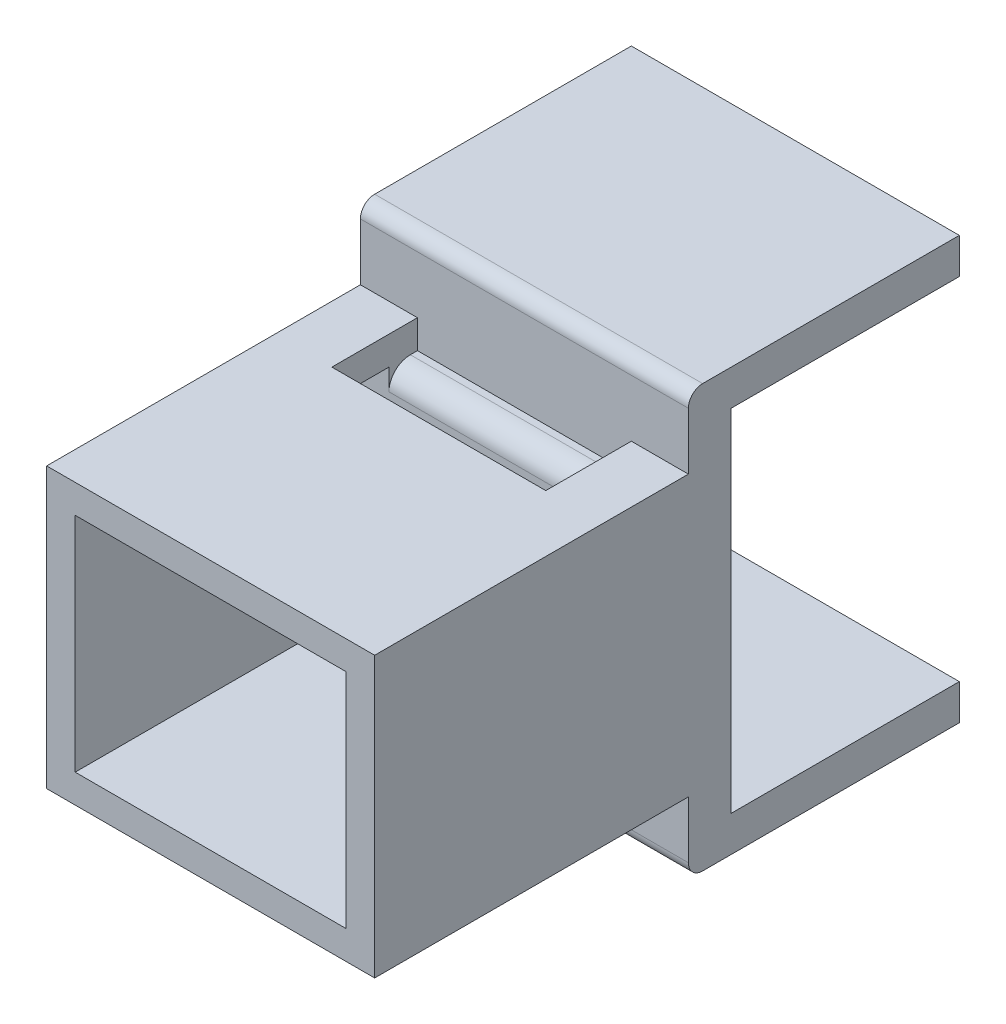
ISO-10303-21;
HEADER;
FILE_DESCRIPTION(('STEP AP214'),'2;1');
FILE_NAME('part.step','',(''),(''),'','','');
FILE_SCHEMA(('AUTOMOTIVE_DESIGN { 1 0 10303 214 1 1 1 1 }'));
ENDSEC;
DATA;
#1=APPLICATION_CONTEXT('core data for automotive mechanical design processes');
#2=APPLICATION_PROTOCOL_DEFINITION('international standard','automotive_design',2000,#1);
#3=PRODUCT_CONTEXT('',#1,'mechanical');
#4=PRODUCT('Part','Part','',(#3));
#5=PRODUCT_RELATED_PRODUCT_CATEGORY('part','',(#4));
#6=PRODUCT_DEFINITION_FORMATION('','',#4);
#7=PRODUCT_DEFINITION_CONTEXT('part definition',#1,'design');
#8=PRODUCT_DEFINITION('design','',#6,#7);
#9=PRODUCT_DEFINITION_SHAPE('','',#8);
#10=(LENGTH_UNIT() NAMED_UNIT(*) SI_UNIT(.MILLI.,.METRE.));
#11=(NAMED_UNIT(*) PLANE_ANGLE_UNIT() SI_UNIT($,.RADIAN.));
#12=(NAMED_UNIT(*) SI_UNIT($,.STERADIAN.) SOLID_ANGLE_UNIT());
#13=UNCERTAINTY_MEASURE_WITH_UNIT(LENGTH_MEASURE(1.E-05),#10,'distance_accuracy_value','');
#14=(GEOMETRIC_REPRESENTATION_CONTEXT(3) GLOBAL_UNCERTAINTY_ASSIGNED_CONTEXT((#13)) GLOBAL_UNIT_ASSIGNED_CONTEXT((#10,
#11,#12)) REPRESENTATION_CONTEXT('',''));
#15=CARTESIAN_POINT('',(0.,0.,0.));
#16=DIRECTION('',(0.,0.,1.));
#17=DIRECTION('',(1.,0.,0.));
#18=AXIS2_PLACEMENT_3D('',#15,#16,#17);
#19=CARTESIAN_POINT('',(0.,0.,-1.5));
#20=DIRECTION('',(0.,0.,1.));
#21=DIRECTION('',(1.,0.,0.));
#22=AXIS2_PLACEMENT_3D('',#19,#20,#21);
#23=PLANE('',#22);
#24=DIRECTION('',(1.,0.,0.));
#25=VECTOR('',#24,1.);
#26=CARTESIAN_POINT('',(11.5,-1.25,-1.5));
#27=LINE('',#26,#25);
#28=CARTESIAN_POINT('',(0.,-1.25,-1.5));
#29=VERTEX_POINT('',#28);
#30=CARTESIAN_POINT('',(11.5,-1.25,-1.5));
#31=VERTEX_POINT('',#30);
#32=EDGE_CURVE('E231',#29,#31,#27,.T.);
#33=ORIENTED_EDGE('',*,*,#32,.F.);
#34=DIRECTION('',(0.,1.,0.));
#35=VECTOR('',#34,1.);
#36=CARTESIAN_POINT('',(0.,-2.5,-1.5));
#37=LINE('',#36,#35);
#38=CARTESIAN_POINT('',(0.,11.05,-1.5));
#39=VERTEX_POINT('',#38);
#40=EDGE_CURVE('E266',#29,#39,#37,.T.);
#41=ORIENTED_EDGE('',*,*,#40,.T.);
#42=DIRECTION('',(-1.,0.,0.));
#43=VECTOR('',#42,1.);
#44=CARTESIAN_POINT('',(11.5,11.05,-1.5));
#45=LINE('',#44,#43);
#46=CARTESIAN_POINT('',(11.5,11.05,-1.5));
#47=VERTEX_POINT('',#46);
#48=EDGE_CURVE('E243',#47,#39,#45,.T.);
#49=ORIENTED_EDGE('',*,*,#48,.F.);
#50=DIRECTION('',(0.,-1.,0.));
#51=VECTOR('',#50,1.);
#52=CARTESIAN_POINT('',(11.5,-2.5,-1.5));
#53=LINE('',#52,#51);
#54=EDGE_CURVE('E264',#47,#31,#53,.T.);
#55=ORIENTED_EDGE('',*,*,#54,.T.);
#56=EDGE_LOOP('',(#33,#41,#49,#55));
#57=FACE_BOUND('',#56,.T.);
#58=ADVANCED_FACE('F33',(#57),#23,.F.);
#59=CARTESIAN_POINT('',(0.,0.,11.));
#60=DIRECTION('',(1.,0.,0.));
#61=DIRECTION('',(0.,0.,-1.));
#62=AXIS2_PLACEMENT_3D('',#59,#60,#61);
#63=PLANE('',#62);
#64=DIRECTION('',(0.,0.,1.));
#65=VECTOR('',#64,1.);
#66=CARTESIAN_POINT('',(0.,-2.5,-1.5));
#67=LINE('',#66,#65);
#68=CARTESIAN_POINT('',(0.,-2.5,-9.5));
#69=VERTEX_POINT('',#68);
#70=CARTESIAN_POINT('',(0.,-2.5,-0.5));
#71=VERTEX_POINT('',#70);
#72=EDGE_CURVE('E217',#69,#71,#67,.T.);
#73=ORIENTED_EDGE('',*,*,#72,.T.);
#74=CARTESIAN_POINT('',(0.,-2.,-0.5));
#75=DIRECTION('',(1.,0.,0.));
#76=DIRECTION('',(0.,0.,-1.));
#77=AXIS2_PLACEMENT_3D('',#74,#75,#76);
#78=CIRCLE('',#77,0.5);
#79=CARTESIAN_POINT('',(0.,-2.,0.));
#80=VERTEX_POINT('',#79);
#81=EDGE_CURVE('E396',#71,#80,#78,.F.);
#82=ORIENTED_EDGE('',*,*,#81,.T.);
#83=DIRECTION('',(0.,1.,0.));
#84=VECTOR('',#83,1.);
#85=CARTESIAN_POINT('',(0.,-2.5,0.));
#86=LINE('',#85,#84);
#87=CARTESIAN_POINT('',(0.,0.,0.));
#88=VERTEX_POINT('',#87);
#89=EDGE_CURVE('E267',#80,#88,#86,.T.);
#90=ORIENTED_EDGE('',*,*,#89,.T.);
#91=DIRECTION('',(0.,0.,-1.));
#92=VECTOR('',#91,1.);
#93=CARTESIAN_POINT('',(0.,0.,11.));
#94=LINE('',#93,#92);
#95=CARTESIAN_POINT('',(0.,0.,11.));
#96=VERTEX_POINT('',#95);
#97=EDGE_CURVE('E365',#96,#88,#94,.T.);
#98=ORIENTED_EDGE('',*,*,#97,.F.);
#99=DIRECTION('',(0.,-1.,0.));
#100=VECTOR('',#99,1.);
#101=CARTESIAN_POINT('',(0.,0.,11.));
#102=LINE('',#101,#100);
#103=CARTESIAN_POINT('',(0.,9.8,11.));
#104=VERTEX_POINT('',#103);
#105=EDGE_CURVE('E341',#104,#96,#102,.T.);
#106=ORIENTED_EDGE('',*,*,#105,.F.);
#107=DIRECTION('',(0.,0.,-1.));
#108=VECTOR('',#107,1.);
#109=CARTESIAN_POINT('',(0.,9.8,11.));
#110=LINE('',#109,#108);
#111=CARTESIAN_POINT('',(0.,9.8,0.));
#112=VERTEX_POINT('',#111);
#113=EDGE_CURVE('E351',#104,#112,#110,.T.);
#114=ORIENTED_EDGE('',*,*,#113,.T.);
#115=CARTESIAN_POINT('',(0.,11.8,0.));
#116=VERTEX_POINT('',#115);
#117=EDGE_CURVE('E272',#112,#116,#86,.T.);
#118=ORIENTED_EDGE('',*,*,#117,.T.);
#119=CARTESIAN_POINT('',(0.,11.8,-0.5));
#120=DIRECTION('',(1.,0.,0.));
#121=DIRECTION('',(0.,0.,-1.));
#122=AXIS2_PLACEMENT_3D('',#119,#120,#121);
#123=CIRCLE('',#122,0.5);
#124=CARTESIAN_POINT('',(0.,12.3,-0.5));
#125=VERTEX_POINT('',#124);
#126=EDGE_CURVE('E394',#116,#125,#123,.F.);
#127=ORIENTED_EDGE('',*,*,#126,.T.);
#128=DIRECTION('',(0.,0.,1.));
#129=VECTOR('',#128,1.);
#130=CARTESIAN_POINT('',(0.,12.3,-1.5));
#131=LINE('',#130,#129);
#132=CARTESIAN_POINT('',(0.,12.3,-9.5));
#133=VERTEX_POINT('',#132);
#134=EDGE_CURVE('E275',#133,#125,#131,.T.);
#135=ORIENTED_EDGE('',*,*,#134,.F.);
#136=DIRECTION('',(0.,1.,0.));
#137=VECTOR('',#136,1.);
#138=CARTESIAN_POINT('',(0.,11.05,-9.5));
#139=LINE('',#138,#137);
#140=CARTESIAN_POINT('',(0.,11.05,-9.5));
#141=VERTEX_POINT('',#140);
#142=EDGE_CURVE('E249',#141,#133,#139,.T.);
#143=ORIENTED_EDGE('',*,*,#142,.F.);
#144=DIRECTION('',(0.,0.,1.));
#145=VECTOR('',#144,1.);
#146=CARTESIAN_POINT('',(0.,11.05,-9.5));
#147=LINE('',#146,#145);
#148=EDGE_CURVE('E255',#141,#39,#147,.T.);
#149=ORIENTED_EDGE('',*,*,#148,.T.);
#150=ORIENTED_EDGE('',*,*,#40,.F.);
#151=DIRECTION('',(0.,0.,1.));
#152=VECTOR('',#151,1.);
#153=CARTESIAN_POINT('',(0.,-1.25,-9.5));
#154=LINE('',#153,#152);
#155=CARTESIAN_POINT('',(0.,-1.25,-9.5));
#156=VERTEX_POINT('',#155);
#157=EDGE_CURVE('E240',#156,#29,#154,.T.);
#158=ORIENTED_EDGE('',*,*,#157,.F.);
#159=DIRECTION('',(0.,1.,0.));
#160=VECTOR('',#159,1.);
#161=CARTESIAN_POINT('',(0.,-2.5,-9.5));
#162=LINE('',#161,#160);
#163=EDGE_CURVE('E225',#69,#156,#162,.T.);
#164=ORIENTED_EDGE('',*,*,#163,.F.);
#165=EDGE_LOOP('',(#73,#82,#90,#98,#106,#114,#118,#127,#135,#143,#149,#150,#158,#164));
#166=FACE_BOUND('',#165,.T.);
#167=ADVANCED_FACE('F413',(#166),#63,.F.);
#168=CARTESIAN_POINT('',(0.,0.,11.));
#169=DIRECTION('',(0.,1.,0.));
#170=DIRECTION('',(0.,0.,1.));
#171=AXIS2_PLACEMENT_3D('',#168,#169,#170);
#172=PLANE('',#171);
#173=DIRECTION('',(1.,0.,0.));
#174=VECTOR('',#173,1.);
#175=CARTESIAN_POINT('',(0.,0.,0.));
#176=LINE('',#175,#174);
#177=CARTESIAN_POINT('',(11.5,0.,0.));
#178=VERTEX_POINT('',#177);
#179=EDGE_CURVE('E334',#88,#178,#176,.T.);
#180=ORIENTED_EDGE('',*,*,#179,.T.);
#181=DIRECTION('',(0.,0.,-1.));
#182=VECTOR('',#181,1.);
#183=CARTESIAN_POINT('',(11.5,0.,11.));
#184=LINE('',#183,#182);
#185=CARTESIAN_POINT('',(11.5,0.,11.));
#186=VERTEX_POINT('',#185);
#187=EDGE_CURVE('E362',#186,#178,#184,.T.);
#188=ORIENTED_EDGE('',*,*,#187,.F.);
#189=DIRECTION('',(1.,0.,0.));
#190=VECTOR('',#189,1.);
#191=CARTESIAN_POINT('',(0.,0.,11.));
#192=LINE('',#191,#190);
#193=EDGE_CURVE('E344',#96,#186,#192,.T.);
#194=ORIENTED_EDGE('',*,*,#193,.F.);
#195=ORIENTED_EDGE('',*,*,#97,.T.);
#196=EDGE_LOOP('',(#180,#188,#194,#195));
#197=FACE_BOUND('',#196,.T.);
#198=ADVANCED_FACE('F433',(#197),#172,.F.);
#199=CARTESIAN_POINT('',(11.5,0.,11.));
#200=DIRECTION('',(-1.,0.,0.));
#201=DIRECTION('',(0.,0.,1.));
#202=AXIS2_PLACEMENT_3D('',#199,#200,#201);
#203=PLANE('',#202);
#204=DIRECTION('',(0.,-1.,0.));
#205=VECTOR('',#204,1.);
#206=CARTESIAN_POINT('',(11.5,-2.5,0.));
#207=LINE('',#206,#205);
#208=CARTESIAN_POINT('',(11.5,-2.,0.));
#209=VERTEX_POINT('',#208);
#210=EDGE_CURVE('E263',#178,#209,#207,.T.);
#211=ORIENTED_EDGE('',*,*,#210,.T.);
#212=CARTESIAN_POINT('',(11.5,-2.,-0.5));
#213=DIRECTION('',(-1.,0.,0.));
#214=DIRECTION('',(0.,0.,1.));
#215=AXIS2_PLACEMENT_3D('',#212,#213,#214);
#216=CIRCLE('',#215,0.5);
#217=CARTESIAN_POINT('',(11.5,-2.5,-0.5));
#218=VERTEX_POINT('',#217);
#219=EDGE_CURVE('E212',#209,#218,#216,.F.);
#220=ORIENTED_EDGE('',*,*,#219,.T.);
#221=DIRECTION('',(0.,0.,1.));
#222=VECTOR('',#221,1.);
#223=CARTESIAN_POINT('',(11.5,-2.5,-1.5));
#224=LINE('',#223,#222);
#225=CARTESIAN_POINT('',(11.5,-2.5,-9.5));
#226=VERTEX_POINT('',#225);
#227=EDGE_CURVE('E204',#226,#218,#224,.T.);
#228=ORIENTED_EDGE('',*,*,#227,.F.);
#229=DIRECTION('',(0.,-1.,0.));
#230=VECTOR('',#229,1.);
#231=CARTESIAN_POINT('',(11.5,-2.5,-9.5));
#232=LINE('',#231,#230);
#233=CARTESIAN_POINT('',(11.5,-1.25,-9.5));
#234=VERTEX_POINT('',#233);
#235=EDGE_CURVE('E210',#234,#226,#232,.T.);
#236=ORIENTED_EDGE('',*,*,#235,.F.);
#237=DIRECTION('',(0.,0.,1.));
#238=VECTOR('',#237,1.);
#239=CARTESIAN_POINT('',(11.5,-1.25,-9.5));
#240=LINE('',#239,#238);
#241=EDGE_CURVE('E237',#234,#31,#240,.T.);
#242=ORIENTED_EDGE('',*,*,#241,.T.);
#243=ORIENTED_EDGE('',*,*,#54,.F.);
#244=DIRECTION('',(0.,0.,1.));
#245=VECTOR('',#244,1.);
#246=CARTESIAN_POINT('',(11.5,11.05,-9.5));
#247=LINE('',#246,#245);
#248=CARTESIAN_POINT('',(11.5,11.05,-9.5));
#249=VERTEX_POINT('',#248);
#250=EDGE_CURVE('E260',#249,#47,#247,.T.);
#251=ORIENTED_EDGE('',*,*,#250,.F.);
#252=DIRECTION('',(0.,-1.,0.));
#253=VECTOR('',#252,1.);
#254=CARTESIAN_POINT('',(11.5,11.05,-9.5));
#255=LINE('',#254,#253);
#256=CARTESIAN_POINT('',(11.5,12.3,-9.5));
#257=VERTEX_POINT('',#256);
#258=EDGE_CURVE('E244',#257,#249,#255,.T.);
#259=ORIENTED_EDGE('',*,*,#258,.F.);
#260=DIRECTION('',(0.,0.,1.));
#261=VECTOR('',#260,1.);
#262=CARTESIAN_POINT('',(11.5,12.3,-1.5));
#263=LINE('',#262,#261);
#264=CARTESIAN_POINT('',(11.5,12.3,-0.5));
#265=VERTEX_POINT('',#264);
#266=EDGE_CURVE('E269',#257,#265,#263,.T.);
#267=ORIENTED_EDGE('',*,*,#266,.T.);
#268=CARTESIAN_POINT('',(11.5,11.8,-0.5));
#269=DIRECTION('',(-1.,0.,0.));
#270=DIRECTION('',(0.,0.,1.));
#271=AXIS2_PLACEMENT_3D('',#268,#269,#270);
#272=CIRCLE('',#271,0.5);
#273=CARTESIAN_POINT('',(11.5,11.8,0.));
#274=VERTEX_POINT('',#273);
#275=EDGE_CURVE('E48',#265,#274,#272,.F.);
#276=ORIENTED_EDGE('',*,*,#275,.T.);
#277=CARTESIAN_POINT('',(11.5,9.8,0.));
#278=VERTEX_POINT('',#277);
#279=EDGE_CURVE('E270',#274,#278,#207,.T.);
#280=ORIENTED_EDGE('',*,*,#279,.T.);
#281=DIRECTION('',(0.,0.,-1.));
#282=VECTOR('',#281,1.);
#283=CARTESIAN_POINT('',(11.5,9.8,11.));
#284=LINE('',#283,#282);
#285=CARTESIAN_POINT('',(11.5,9.8,11.));
#286=VERTEX_POINT('',#285);
#287=EDGE_CURVE('E359',#286,#278,#284,.T.);
#288=ORIENTED_EDGE('',*,*,#287,.F.);
#289=DIRECTION('',(0.,1.,0.));
#290=VECTOR('',#289,1.);
#291=CARTESIAN_POINT('',(11.5,0.,11.));
#292=LINE('',#291,#290);
#293=EDGE_CURVE('E347',#186,#286,#292,.T.);
#294=ORIENTED_EDGE('',*,*,#293,.F.);
#295=ORIENTED_EDGE('',*,*,#187,.T.);
#296=EDGE_LOOP('',(#211,#220,#228,#236,#242,#243,#251,#259,#267,#276,#280,#288,#294,#295));
#297=FACE_BOUND('',#296,.T.);
#298=ADVANCED_FACE('F207',(#297),#203,.F.);
#299=CARTESIAN_POINT('',(0.,9.8,11.));
#300=DIRECTION('',(0.,-1.,0.));
#301=DIRECTION('',(0.,0.,-1.));
#302=AXIS2_PLACEMENT_3D('',#299,#300,#301);
#303=PLANE('',#302);
#304=DIRECTION('',(1.,0.,0.));
#305=VECTOR('',#304,1.);
#306=CARTESIAN_POINT('',(2.,9.8,3.));
#307=LINE('',#306,#305);
#308=CARTESIAN_POINT('',(2.,9.8,3.));
#309=VERTEX_POINT('',#308);
#310=CARTESIAN_POINT('',(9.5,9.8,3.));
#311=VERTEX_POINT('',#310);
#312=EDGE_CURVE('E293',#309,#311,#307,.T.);
#313=ORIENTED_EDGE('',*,*,#312,.F.);
#314=DIRECTION('',(0.,0.,1.));
#315=VECTOR('',#314,1.);
#316=CARTESIAN_POINT('',(2.,9.8,0.));
#317=LINE('',#316,#315);
#318=CARTESIAN_POINT('',(2.,9.8,0.));
#319=VERTEX_POINT('',#318);
#320=EDGE_CURVE('E216',#319,#309,#317,.T.);
#321=ORIENTED_EDGE('',*,*,#320,.F.);
#322=DIRECTION('',(-1.,0.,0.));
#323=VECTOR('',#322,1.);
#324=CARTESIAN_POINT('',(0.,9.8,0.));
#325=LINE('',#324,#323);
#326=EDGE_CURVE('E354',#319,#112,#325,.T.);
#327=ORIENTED_EDGE('',*,*,#326,.T.);
#328=ORIENTED_EDGE('',*,*,#113,.F.);
#329=DIRECTION('',(-1.,0.,0.));
#330=VECTOR('',#329,1.);
#331=CARTESIAN_POINT('',(0.,9.8,11.));
#332=LINE('',#331,#330);
#333=EDGE_CURVE('E349',#286,#104,#332,.T.);
#334=ORIENTED_EDGE('',*,*,#333,.F.);
#335=ORIENTED_EDGE('',*,*,#287,.T.);
#336=CARTESIAN_POINT('',(9.5,9.8,0.));
#337=VERTEX_POINT('',#336);
#338=EDGE_CURVE('E345',#278,#337,#325,.T.);
#339=ORIENTED_EDGE('',*,*,#338,.T.);
#340=DIRECTION('',(0.,0.,-1.));
#341=VECTOR('',#340,1.);
#342=CARTESIAN_POINT('',(9.5,9.8,0.));
#343=LINE('',#342,#341);
#344=EDGE_CURVE('E296',#311,#337,#343,.T.);
#345=ORIENTED_EDGE('',*,*,#344,.F.);
#346=EDGE_LOOP('',(#313,#321,#327,#328,#334,#335,#339,#345));
#347=FACE_BOUND('',#346,.T.);
#348=ADVANCED_FACE('F426',(#347),#303,.F.);
#349=CARTESIAN_POINT('',(0.,0.,11.));
#350=DIRECTION('',(0.,0.,-1.));
#351=DIRECTION('',(-1.,0.,0.));
#352=AXIS2_PLACEMENT_3D('',#349,#350,#351);
#353=PLANE('',#352);
#354=DIRECTION('',(1.,0.,0.));
#355=VECTOR('',#354,1.);
#356=CARTESIAN_POINT('',(1.,1.,11.));
#357=LINE('',#356,#355);
#358=CARTESIAN_POINT('',(1.,1.,11.));
#359=VERTEX_POINT('',#358);
#360=CARTESIAN_POINT('',(10.5,1.,11.));
#361=VERTEX_POINT('',#360);
#362=EDGE_CURVE('E324',#359,#361,#357,.T.);
#363=ORIENTED_EDGE('',*,*,#362,.F.);
#364=DIRECTION('',(0.,-1.,0.));
#365=VECTOR('',#364,1.);
#366=CARTESIAN_POINT('',(1.,1.,11.));
#367=LINE('',#366,#365);
#368=CARTESIAN_POINT('',(1.,8.8,11.));
#369=VERTEX_POINT('',#368);
#370=EDGE_CURVE('E302',#369,#359,#367,.T.);
#371=ORIENTED_EDGE('',*,*,#370,.F.);
#372=DIRECTION('',(-1.,0.,0.));
#373=VECTOR('',#372,1.);
#374=CARTESIAN_POINT('',(1.,8.8,11.));
#375=LINE('',#374,#373);
#376=CARTESIAN_POINT('',(10.5,8.8,11.));
#377=VERTEX_POINT('',#376);
#378=EDGE_CURVE('E312',#377,#369,#375,.T.);
#379=ORIENTED_EDGE('',*,*,#378,.F.);
#380=DIRECTION('',(0.,1.,0.));
#381=VECTOR('',#380,1.);
#382=CARTESIAN_POINT('',(10.5,1.,11.));
#383=LINE('',#382,#381);
#384=EDGE_CURVE('E327',#361,#377,#383,.T.);
#385=ORIENTED_EDGE('',*,*,#384,.F.);
#386=EDGE_LOOP('',(#363,#371,#379,#385));
#387=FACE_BOUND('',#386,.T.);
#388=ORIENTED_EDGE('',*,*,#105,.T.);
#389=ORIENTED_EDGE('',*,*,#193,.T.);
#390=ORIENTED_EDGE('',*,*,#293,.T.);
#391=ORIENTED_EDGE('',*,*,#333,.T.);
#392=EDGE_LOOP('',(#388,#389,#390,#391));
#393=FACE_BOUND('',#392,.T.);
#394=ADVANCED_FACE('F429',(#387,#393),#353,.F.);
#395=CARTESIAN_POINT('',(1.,1.,0.999999999999999));
#396=DIRECTION('',(-1.,0.,0.));
#397=DIRECTION('',(0.,0.,1.));
#398=AXIS2_PLACEMENT_3D('',#395,#396,#397);
#399=PLANE('',#398);
#400=ORIENTED_EDGE('',*,*,#370,.T.);
#401=DIRECTION('',(0.,0.,1.));
#402=VECTOR('',#401,1.);
#403=CARTESIAN_POINT('',(1.,1.,0.999999999999999));
#404=LINE('',#403,#402);
#405=CARTESIAN_POINT('',(1.,1.,0.999999999999999));
#406=VERTEX_POINT('',#405);
#407=EDGE_CURVE('E322',#406,#359,#404,.T.);
#408=ORIENTED_EDGE('',*,*,#407,.F.);
#409=DIRECTION('',(0.,-1.,0.));
#410=VECTOR('',#409,1.);
#411=CARTESIAN_POINT('',(1.,1.,0.999999999999999));
#412=LINE('',#411,#410);
#413=CARTESIAN_POINT('',(1.,8.8,0.999999999999999));
#414=VERTEX_POINT('',#413);
#415=EDGE_CURVE('E308',#414,#406,#412,.T.);
#416=ORIENTED_EDGE('',*,*,#415,.F.);
#417=DIRECTION('',(0.,0.,1.));
#418=VECTOR('',#417,1.);
#419=CARTESIAN_POINT('',(1.,8.8,0.999999999999999));
#420=LINE('',#419,#418);
#421=EDGE_CURVE('E332',#414,#369,#420,.T.);
#422=ORIENTED_EDGE('',*,*,#421,.T.);
#423=EDGE_LOOP('',(#400,#408,#416,#422));
#424=FACE_BOUND('',#423,.T.);
#425=ADVANCED_FACE('F489',(#424),#399,.F.);
#426=CARTESIAN_POINT('',(1.,8.8,0.999999999999999));
#427=DIRECTION('',(0.,1.,0.));
#428=DIRECTION('',(0.,0.,1.));
#429=AXIS2_PLACEMENT_3D('',#426,#427,#428);
#430=PLANE('',#429);
#431=DIRECTION('',(1.,0.,0.));
#432=VECTOR('',#431,1.);
#433=CARTESIAN_POINT('',(1.,8.8,3.75));
#434=LINE('',#433,#432);
#435=CARTESIAN_POINT('',(2.,8.8,3.75));
#436=VERTEX_POINT('',#435);
#437=CARTESIAN_POINT('',(9.5,8.8,3.75));
#438=VERTEX_POINT('',#437);
#439=EDGE_CURVE('E368',#436,#438,#434,.T.);
#440=ORIENTED_EDGE('',*,*,#439,.T.);
#441=DIRECTION('',(0.,0.,-1.));
#442=VECTOR('',#441,1.);
#443=CARTESIAN_POINT('',(9.5,8.8,0.));
#444=LINE('',#443,#442);
#445=CARTESIAN_POINT('',(9.5,8.8,0.999999999999999));
#446=VERTEX_POINT('',#445);
#447=EDGE_CURVE('E284',#438,#446,#444,.T.);
#448=ORIENTED_EDGE('',*,*,#447,.T.);
#449=DIRECTION('',(-1.,0.,0.));
#450=VECTOR('',#449,1.);
#451=CARTESIAN_POINT('',(1.,8.8,0.999999999999999));
#452=LINE('',#451,#450);
#453=CARTESIAN_POINT('',(10.5,8.8,0.999999999999999));
#454=VERTEX_POINT('',#453);
#455=EDGE_CURVE('E319',#454,#446,#452,.T.);
#456=ORIENTED_EDGE('',*,*,#455,.F.);
#457=DIRECTION('',(0.,0.,1.));
#458=VECTOR('',#457,1.);
#459=CARTESIAN_POINT('',(10.5,8.8,0.999999999999999));
#460=LINE('',#459,#458);
#461=EDGE_CURVE('E335',#454,#377,#460,.T.);
#462=ORIENTED_EDGE('',*,*,#461,.T.);
#463=ORIENTED_EDGE('',*,*,#378,.T.);
#464=ORIENTED_EDGE('',*,*,#421,.F.);
#465=CARTESIAN_POINT('',(2.,8.8,0.999999999999999));
#466=VERTEX_POINT('',#465);
#467=EDGE_CURVE('E318',#466,#414,#452,.T.);
#468=ORIENTED_EDGE('',*,*,#467,.F.);
#469=DIRECTION('',(0.,0.,1.));
#470=VECTOR('',#469,1.);
#471=CARTESIAN_POINT('',(2.,8.8,0.));
#472=LINE('',#471,#470);
#473=EDGE_CURVE('E283',#466,#436,#472,.T.);
#474=ORIENTED_EDGE('',*,*,#473,.T.);
#475=EDGE_LOOP('',(#440,#448,#456,#462,#463,#464,#468,#474));
#476=FACE_BOUND('',#475,.T.);
#477=ADVANCED_FACE('F485',(#476),#430,.F.);
#478=CARTESIAN_POINT('',(10.5,1.,0.999999999999999));
#479=DIRECTION('',(1.,0.,0.));
#480=DIRECTION('',(0.,0.,-1.));
#481=AXIS2_PLACEMENT_3D('',#478,#479,#480);
#482=PLANE('',#481);
#483=ORIENTED_EDGE('',*,*,#384,.T.);
#484=ORIENTED_EDGE('',*,*,#461,.F.);
#485=DIRECTION('',(0.,1.,0.));
#486=VECTOR('',#485,1.);
#487=CARTESIAN_POINT('',(10.5,1.,0.999999999999999));
#488=LINE('',#487,#486);
#489=CARTESIAN_POINT('',(10.5,1.,0.999999999999999));
#490=VERTEX_POINT('',#489);
#491=EDGE_CURVE('E315',#490,#454,#488,.T.);
#492=ORIENTED_EDGE('',*,*,#491,.F.);
#493=DIRECTION('',(0.,0.,1.));
#494=VECTOR('',#493,1.);
#495=CARTESIAN_POINT('',(10.5,1.,0.999999999999999));
#496=LINE('',#495,#494);
#497=EDGE_CURVE('E337',#490,#361,#496,.T.);
#498=ORIENTED_EDGE('',*,*,#497,.T.);
#499=EDGE_LOOP('',(#483,#484,#492,#498));
#500=FACE_BOUND('',#499,.T.);
#501=ADVANCED_FACE('F488',(#500),#482,.F.);
#502=CARTESIAN_POINT('',(1.,1.,0.999999999999999));
#503=DIRECTION('',(0.,-1.,0.));
#504=DIRECTION('',(0.,0.,-1.));
#505=AXIS2_PLACEMENT_3D('',#502,#503,#504);
#506=PLANE('',#505);
#507=ORIENTED_EDGE('',*,*,#362,.T.);
#508=ORIENTED_EDGE('',*,*,#497,.F.);
#509=DIRECTION('',(1.,0.,0.));
#510=VECTOR('',#509,1.);
#511=CARTESIAN_POINT('',(1.,1.,0.999999999999999));
#512=LINE('',#511,#510);
#513=EDGE_CURVE('E311',#406,#490,#512,.T.);
#514=ORIENTED_EDGE('',*,*,#513,.F.);
#515=ORIENTED_EDGE('',*,*,#407,.T.);
#516=EDGE_LOOP('',(#507,#508,#514,#515));
#517=FACE_BOUND('',#516,.T.);
#518=ADVANCED_FACE('F483',(#517),#506,.F.);
#519=CARTESIAN_POINT('',(0.,0.,0.999999999999999));
#520=DIRECTION('',(0.,0.,-1.));
#521=DIRECTION('',(-1.,0.,0.));
#522=AXIS2_PLACEMENT_3D('',#519,#520,#521);
#523=PLANE('',#522);
#524=DIRECTION('',(-1.,0.,0.));
#525=VECTOR('',#524,1.);
#526=CARTESIAN_POINT('',(2.,8.05,0.999999999999999));
#527=LINE('',#526,#525);
#528=CARTESIAN_POINT('',(9.5,8.05,0.999999999999999));
#529=VERTEX_POINT('',#528);
#530=CARTESIAN_POINT('',(2.,8.05,0.999999999999999));
#531=VERTEX_POINT('',#530);
#532=EDGE_CURVE('E376',#529,#531,#527,.T.);
#533=ORIENTED_EDGE('',*,*,#532,.T.);
#534=DIRECTION('',(0.,1.,0.));
#535=VECTOR('',#534,1.);
#536=CARTESIAN_POINT('',(2.,0.,0.999999999999999));
#537=LINE('',#536,#535);
#538=EDGE_CURVE('E379',#531,#466,#537,.T.);
#539=ORIENTED_EDGE('',*,*,#538,.T.);
#540=ORIENTED_EDGE('',*,*,#467,.T.);
#541=ORIENTED_EDGE('',*,*,#415,.T.);
#542=ORIENTED_EDGE('',*,*,#513,.T.);
#543=ORIENTED_EDGE('',*,*,#491,.T.);
#544=ORIENTED_EDGE('',*,*,#455,.T.);
#545=DIRECTION('',(0.,-1.,0.));
#546=VECTOR('',#545,1.);
#547=CARTESIAN_POINT('',(9.5,0.,0.999999999999999));
#548=LINE('',#547,#546);
#549=EDGE_CURVE('E373',#446,#529,#548,.T.);
#550=ORIENTED_EDGE('',*,*,#549,.T.);
#551=EDGE_LOOP('',(#533,#539,#540,#541,#542,#543,#544,#550));
#552=FACE_BOUND('',#551,.T.);
#553=ADVANCED_FACE('F467',(#552),#523,.F.);
#554=CARTESIAN_POINT('',(0.,8.8,0.));
#555=DIRECTION('',(0.,1.,0.));
#556=DIRECTION('',(0.,0.,1.));
#557=AXIS2_PLACEMENT_3D('',#554,#555,#556);
#558=PLANE('',#557);
#559=CARTESIAN_POINT('',(2.,8.8,0.));
#560=VERTEX_POINT('',#559);
#561=CARTESIAN_POINT('',(2.,8.8,0.249999999999999));
#562=VERTEX_POINT('',#561);
#563=EDGE_CURVE('E279',#560,#562,#472,.T.);
#564=ORIENTED_EDGE('',*,*,#563,.T.);
#565=DIRECTION('',(-1.,0.,0.));
#566=VECTOR('',#565,1.);
#567=CARTESIAN_POINT('',(9.5,8.8,0.249999999999999));
#568=LINE('',#567,#566);
#569=CARTESIAN_POINT('',(9.5,8.8,0.249999999999999));
#570=VERTEX_POINT('',#569);
#571=EDGE_CURVE('E381',#562,#570,#568,.F.);
#572=ORIENTED_EDGE('',*,*,#571,.T.);
#573=CARTESIAN_POINT('',(9.5,8.8,0.));
#574=VERTEX_POINT('',#573);
#575=EDGE_CURVE('E282',#570,#574,#444,.T.);
#576=ORIENTED_EDGE('',*,*,#575,.T.);
#577=DIRECTION('',(-1.,0.,0.));
#578=VECTOR('',#577,1.);
#579=CARTESIAN_POINT('',(2.,8.8,0.));
#580=LINE('',#579,#578);
#581=EDGE_CURVE('E287',#574,#560,#580,.T.);
#582=ORIENTED_EDGE('',*,*,#581,.T.);
#583=EDGE_LOOP('',(#564,#572,#576,#582));
#584=FACE_BOUND('',#583,.T.);
#585=ADVANCED_FACE('F463',(#584),#558,.T.);
#586=CARTESIAN_POINT('',(2.,8.8,0.));
#587=DIRECTION('',(-1.,0.,0.));
#588=DIRECTION('',(0.,0.,1.));
#589=AXIS2_PLACEMENT_3D('',#586,#587,#588);
#590=PLANE('',#589);
#591=ORIENTED_EDGE('',*,*,#320,.T.);
#592=DIRECTION('',(0.,1.,0.));
#593=VECTOR('',#592,1.);
#594=CARTESIAN_POINT('',(2.,8.8,3.));
#595=LINE('',#594,#593);
#596=CARTESIAN_POINT('',(2.,9.55,3.));
#597=VERTEX_POINT('',#596);
#598=EDGE_CURVE('E290',#597,#309,#595,.T.);
#599=ORIENTED_EDGE('',*,*,#598,.F.);
#600=CARTESIAN_POINT('',(2.,9.55,3.75));
#601=DIRECTION('',(-1.,0.,0.));
#602=DIRECTION('',(0.,0.,1.));
#603=AXIS2_PLACEMENT_3D('',#600,#601,#602);
#604=CIRCLE('',#603,0.75);
#605=EDGE_CURVE('E385',#597,#436,#604,.T.);
#606=ORIENTED_EDGE('',*,*,#605,.T.);
#607=ORIENTED_EDGE('',*,*,#473,.F.);
#608=ORIENTED_EDGE('',*,*,#538,.F.);
#609=CARTESIAN_POINT('',(2.,8.05,0.249999999999999));
#610=DIRECTION('',(-1.,0.,0.));
#611=DIRECTION('',(0.,0.,1.));
#612=AXIS2_PLACEMENT_3D('',#609,#610,#611);
#613=CIRCLE('',#612,0.75);
#614=EDGE_CURVE('E388',#531,#562,#613,.T.);
#615=ORIENTED_EDGE('',*,*,#614,.T.);
#616=ORIENTED_EDGE('',*,*,#563,.F.);
#617=DIRECTION('',(0.,1.,0.));
#618=VECTOR('',#617,1.);
#619=CARTESIAN_POINT('',(2.,8.8,0.));
#620=LINE('',#619,#618);
#621=EDGE_CURVE('E299',#560,#319,#620,.T.);
#622=ORIENTED_EDGE('',*,*,#621,.T.);
#623=EDGE_LOOP('',(#591,#599,#606,#607,#608,#615,#616,#622));
#624=FACE_BOUND('',#623,.T.);
#625=ADVANCED_FACE('F466',(#624),#590,.F.);
#626=CARTESIAN_POINT('',(9.5,8.8,0.));
#627=DIRECTION('',(1.,0.,0.));
#628=DIRECTION('',(0.,0.,-1.));
#629=AXIS2_PLACEMENT_3D('',#626,#627,#628);
#630=PLANE('',#629);
#631=ORIENTED_EDGE('',*,*,#344,.T.);
#632=DIRECTION('',(0.,1.,0.));
#633=VECTOR('',#632,1.);
#634=CARTESIAN_POINT('',(9.5,8.8,0.));
#635=LINE('',#634,#633);
#636=EDGE_CURVE('E303',#574,#337,#635,.T.);
#637=ORIENTED_EDGE('',*,*,#636,.F.);
#638=ORIENTED_EDGE('',*,*,#575,.F.);
#639=CARTESIAN_POINT('',(9.5,8.05,0.249999999999999));
#640=DIRECTION('',(1.,0.,0.));
#641=DIRECTION('',(0.,0.,-1.));
#642=AXIS2_PLACEMENT_3D('',#639,#640,#641);
#643=CIRCLE('',#642,0.75);
#644=EDGE_CURVE('E390',#570,#529,#643,.T.);
#645=ORIENTED_EDGE('',*,*,#644,.T.);
#646=ORIENTED_EDGE('',*,*,#549,.F.);
#647=ORIENTED_EDGE('',*,*,#447,.F.);
#648=CARTESIAN_POINT('',(9.5,9.55,3.75));
#649=DIRECTION('',(1.,0.,0.));
#650=DIRECTION('',(0.,0.,-1.));
#651=AXIS2_PLACEMENT_3D('',#648,#649,#650);
#652=CIRCLE('',#651,0.75);
#653=CARTESIAN_POINT('',(9.5,9.55,3.));
#654=VERTEX_POINT('',#653);
#655=EDGE_CURVE('E383',#438,#654,#652,.T.);
#656=ORIENTED_EDGE('',*,*,#655,.T.);
#657=DIRECTION('',(0.,1.,0.));
#658=VECTOR('',#657,1.);
#659=CARTESIAN_POINT('',(9.5,8.8,3.));
#660=LINE('',#659,#658);
#661=EDGE_CURVE('E305',#654,#311,#660,.T.);
#662=ORIENTED_EDGE('',*,*,#661,.T.);
#663=EDGE_LOOP('',(#631,#637,#638,#645,#646,#647,#656,#662));
#664=FACE_BOUND('',#663,.T.);
#665=ADVANCED_FACE('F469',(#664),#630,.F.);
#666=CARTESIAN_POINT('',(2.,8.8,3.));
#667=DIRECTION('',(0.,0.,1.));
#668=DIRECTION('',(1.,0.,0.));
#669=AXIS2_PLACEMENT_3D('',#666,#667,#668);
#670=PLANE('',#669);
#671=ORIENTED_EDGE('',*,*,#661,.F.);
#672=DIRECTION('',(1.,0.,0.));
#673=VECTOR('',#672,1.);
#674=CARTESIAN_POINT('',(2.,9.55,3.));
#675=LINE('',#674,#673);
#676=EDGE_CURVE('E371',#654,#597,#675,.F.);
#677=ORIENTED_EDGE('',*,*,#676,.T.);
#678=ORIENTED_EDGE('',*,*,#598,.T.);
#679=ORIENTED_EDGE('',*,*,#312,.T.);
#680=EDGE_LOOP('',(#671,#677,#678,#679));
#681=FACE_BOUND('',#680,.T.);
#682=ADVANCED_FACE('F472',(#681),#670,.F.);
#683=CARTESIAN_POINT('',(1.,9.55,3.75));
#684=DIRECTION('',(1.,0.,0.));
#685=DIRECTION('',(0.,0.,-1.));
#686=AXIS2_PLACEMENT_3D('',#683,#684,#685);
#687=CYLINDRICAL_SURFACE('',#686,0.75);
#688=ORIENTED_EDGE('',*,*,#605,.F.);
#689=ORIENTED_EDGE('',*,*,#676,.F.);
#690=ORIENTED_EDGE('',*,*,#655,.F.);
#691=ORIENTED_EDGE('',*,*,#439,.F.);
#692=EDGE_LOOP('',(#688,#689,#690,#691));
#693=FACE_BOUND('',#692,.T.);
#694=ADVANCED_FACE('F476',(#693),#687,.T.);
#695=CARTESIAN_POINT('',(0.,8.05,0.249999999999999));
#696=DIRECTION('',(1.,0.,0.));
#697=DIRECTION('',(0.,0.,-1.));
#698=AXIS2_PLACEMENT_3D('',#695,#696,#697);
#699=CYLINDRICAL_SURFACE('',#698,0.75);
#700=ORIENTED_EDGE('',*,*,#644,.F.);
#701=ORIENTED_EDGE('',*,*,#571,.F.);
#702=ORIENTED_EDGE('',*,*,#614,.F.);
#703=ORIENTED_EDGE('',*,*,#532,.F.);
#704=EDGE_LOOP('',(#700,#701,#702,#703));
#705=FACE_BOUND('',#704,.T.);
#706=ADVANCED_FACE('F458',(#705),#699,.T.);
#707=CARTESIAN_POINT('',(0.,0.,0.));
#708=DIRECTION('',(0.,0.,1.));
#709=DIRECTION('',(1.,0.,0.));
#710=AXIS2_PLACEMENT_3D('',#707,#708,#709);
#711=PLANE('',#710);
#712=ORIENTED_EDGE('',*,*,#89,.F.);
#713=DIRECTION('',(-1.,0.,0.));
#714=VECTOR('',#713,1.);
#715=CARTESIAN_POINT('',(11.5,-2.,0.));
#716=LINE('',#715,#714);
#717=EDGE_CURVE('E398',#80,#209,#716,.F.);
#718=ORIENTED_EDGE('',*,*,#717,.T.);
#719=ORIENTED_EDGE('',*,*,#210,.F.);
#720=ORIENTED_EDGE('',*,*,#179,.F.);
#721=EDGE_LOOP('',(#712,#718,#719,#720));
#722=FACE_BOUND('',#721,.T.);
#723=ADVANCED_FACE('F455',(#722),#711,.T.);
#724=ORIENTED_EDGE('',*,*,#279,.F.);
#725=DIRECTION('',(1.,0.,0.));
#726=VECTOR('',#725,1.);
#727=CARTESIAN_POINT('',(0.,11.8,0.));
#728=LINE('',#727,#726);
#729=EDGE_CURVE('E11',#274,#116,#728,.F.);
#730=ORIENTED_EDGE('',*,*,#729,.T.);
#731=ORIENTED_EDGE('',*,*,#117,.F.);
#732=ORIENTED_EDGE('',*,*,#326,.F.);
#733=ORIENTED_EDGE('',*,*,#621,.F.);
#734=ORIENTED_EDGE('',*,*,#581,.F.);
#735=ORIENTED_EDGE('',*,*,#636,.T.);
#736=ORIENTED_EDGE('',*,*,#338,.F.);
#737=EDGE_LOOP('',(#724,#730,#731,#732,#733,#734,#735,#736));
#738=FACE_BOUND('',#737,.T.);
#739=ADVANCED_FACE('F417',(#738),#711,.T.);
#740=CARTESIAN_POINT('',(11.5,-2.5,-1.5));
#741=DIRECTION('',(0.,1.,0.));
#742=DIRECTION('',(0.,0.,1.));
#743=AXIS2_PLACEMENT_3D('',#740,#741,#742);
#744=PLANE('',#743);
#745=ORIENTED_EDGE('',*,*,#227,.T.);
#746=DIRECTION('',(-1.,0.,0.));
#747=VECTOR('',#746,1.);
#748=CARTESIAN_POINT('',(0.,-2.5,-0.5));
#749=LINE('',#748,#747);
#750=EDGE_CURVE('E392',#218,#71,#749,.T.);
#751=ORIENTED_EDGE('',*,*,#750,.T.);
#752=ORIENTED_EDGE('',*,*,#72,.F.);
#753=DIRECTION('',(-1.,0.,0.));
#754=VECTOR('',#753,1.);
#755=CARTESIAN_POINT('',(11.5,-2.5,-9.5));
#756=LINE('',#755,#754);
#757=EDGE_CURVE('E220',#226,#69,#756,.T.);
#758=ORIENTED_EDGE('',*,*,#757,.F.);
#759=EDGE_LOOP('',(#745,#751,#752,#758));
#760=FACE_BOUND('',#759,.T.);
#761=ADVANCED_FACE('F221',(#760),#744,.F.);
#762=CARTESIAN_POINT('',(11.5,12.3,-1.5));
#763=DIRECTION('',(0.,-1.,0.));
#764=DIRECTION('',(0.,0.,-1.));
#765=AXIS2_PLACEMENT_3D('',#762,#763,#764);
#766=PLANE('',#765);
#767=ORIENTED_EDGE('',*,*,#134,.T.);
#768=DIRECTION('',(1.,0.,0.));
#769=VECTOR('',#768,1.);
#770=CARTESIAN_POINT('',(11.5,12.3,-0.5));
#771=LINE('',#770,#769);
#772=EDGE_CURVE('E41',#125,#265,#771,.T.);
#773=ORIENTED_EDGE('',*,*,#772,.T.);
#774=ORIENTED_EDGE('',*,*,#266,.F.);
#775=DIRECTION('',(1.,0.,0.));
#776=VECTOR('',#775,1.);
#777=CARTESIAN_POINT('',(11.5,12.3,-9.5));
#778=LINE('',#777,#776);
#779=EDGE_CURVE('E252',#133,#257,#778,.T.);
#780=ORIENTED_EDGE('',*,*,#779,.F.);
#781=EDGE_LOOP('',(#767,#773,#774,#780));
#782=FACE_BOUND('',#781,.T.);
#783=ADVANCED_FACE('F402',(#782),#766,.F.);
#784=CARTESIAN_POINT('',(11.5,11.05,-9.5));
#785=DIRECTION('',(0.,1.,0.));
#786=DIRECTION('',(0.,0.,1.));
#787=AXIS2_PLACEMENT_3D('',#784,#785,#786);
#788=PLANE('',#787);
#789=ORIENTED_EDGE('',*,*,#48,.T.);
#790=ORIENTED_EDGE('',*,*,#148,.F.);
#791=DIRECTION('',(-1.,0.,0.));
#792=VECTOR('',#791,1.);
#793=CARTESIAN_POINT('',(11.5,11.05,-9.5));
#794=LINE('',#793,#792);
#795=EDGE_CURVE('E247',#249,#141,#794,.T.);
#796=ORIENTED_EDGE('',*,*,#795,.F.);
#797=ORIENTED_EDGE('',*,*,#250,.T.);
#798=EDGE_LOOP('',(#789,#790,#796,#797));
#799=FACE_BOUND('',#798,.T.);
#800=ADVANCED_FACE('F445',(#799),#788,.F.);
#801=CARTESIAN_POINT('',(0.,0.,-9.5));
#802=DIRECTION('',(0.,0.,1.));
#803=DIRECTION('',(1.,0.,0.));
#804=AXIS2_PLACEMENT_3D('',#801,#802,#803);
#805=PLANE('',#804);
#806=ORIENTED_EDGE('',*,*,#258,.T.);
#807=ORIENTED_EDGE('',*,*,#795,.T.);
#808=ORIENTED_EDGE('',*,*,#142,.T.);
#809=ORIENTED_EDGE('',*,*,#779,.T.);
#810=EDGE_LOOP('',(#806,#807,#808,#809));
#811=FACE_BOUND('',#810,.T.);
#812=ADVANCED_FACE('F409',(#811),#805,.F.);
#813=CARTESIAN_POINT('',(11.5,-1.25,-9.5));
#814=DIRECTION('',(0.,-1.,0.));
#815=DIRECTION('',(0.,0.,-1.));
#816=AXIS2_PLACEMENT_3D('',#813,#814,#815);
#817=PLANE('',#816);
#818=ORIENTED_EDGE('',*,*,#32,.T.);
#819=ORIENTED_EDGE('',*,*,#241,.F.);
#820=DIRECTION('',(1.,0.,0.));
#821=VECTOR('',#820,1.);
#822=CARTESIAN_POINT('',(11.5,-1.25,-9.5));
#823=LINE('',#822,#821);
#824=EDGE_CURVE('E229',#156,#234,#823,.T.);
#825=ORIENTED_EDGE('',*,*,#824,.F.);
#826=ORIENTED_EDGE('',*,*,#157,.T.);
#827=EDGE_LOOP('',(#818,#819,#825,#826));
#828=FACE_BOUND('',#827,.T.);
#829=ADVANCED_FACE('F442',(#828),#817,.F.);
#830=CARTESIAN_POINT('',(0.,0.,-9.5));
#831=DIRECTION('',(0.,0.,1.));
#832=DIRECTION('',(1.,0.,0.));
#833=AXIS2_PLACEMENT_3D('',#830,#831,#832);
#834=PLANE('',#833);
#835=ORIENTED_EDGE('',*,*,#235,.T.);
#836=ORIENTED_EDGE('',*,*,#757,.T.);
#837=ORIENTED_EDGE('',*,*,#163,.T.);
#838=ORIENTED_EDGE('',*,*,#824,.T.);
#839=EDGE_LOOP('',(#835,#836,#837,#838));
#840=FACE_BOUND('',#839,.T.);
#841=ADVANCED_FACE('F227',(#840),#834,.F.);
#842=CARTESIAN_POINT('',(11.5,-2.,-0.5));
#843=DIRECTION('',(1.,0.,0.));
#844=DIRECTION('',(0.,0.,-1.));
#845=AXIS2_PLACEMENT_3D('',#842,#843,#844);
#846=CYLINDRICAL_SURFACE('',#845,0.5);
#847=ORIENTED_EDGE('',*,*,#219,.F.);
#848=ORIENTED_EDGE('',*,*,#717,.F.);
#849=ORIENTED_EDGE('',*,*,#81,.F.);
#850=ORIENTED_EDGE('',*,*,#750,.F.);
#851=EDGE_LOOP('',(#847,#848,#849,#850));
#852=FACE_BOUND('',#851,.T.);
#853=ADVANCED_FACE('F438',(#852),#846,.T.);
#854=CARTESIAN_POINT('',(11.5,11.8,-0.5));
#855=DIRECTION('',(-1.,0.,0.));
#856=DIRECTION('',(0.,0.,1.));
#857=AXIS2_PLACEMENT_3D('',#854,#855,#856);
#858=CYLINDRICAL_SURFACE('',#857,0.5);
#859=ORIENTED_EDGE('',*,*,#126,.F.);
#860=ORIENTED_EDGE('',*,*,#729,.F.);
#861=ORIENTED_EDGE('',*,*,#275,.F.);
#862=ORIENTED_EDGE('',*,*,#772,.F.);
#863=EDGE_LOOP('',(#859,#860,#861,#862));
#864=FACE_BOUND('',#863,.T.);
#865=ADVANCED_FACE('F35',(#864),#858,.T.);
#866=CLOSED_SHELL('',(#58,#167,#198,#298,#348,#394,#425,#477,#501,#518,#553,#585,#625,#665,#682,
#694,#706,#723,#739,#761,#783,#800,#812,#829,#841,#853,#865));
#867=MANIFOLD_SOLID_BREP('B2',#866);
#868=ADVANCED_BREP_SHAPE_REPRESENTATION('',(#18,#867),#14);
#869=SHAPE_DEFINITION_REPRESENTATION(#9,#868);
ENDSEC;
END-ISO-10303-21;
